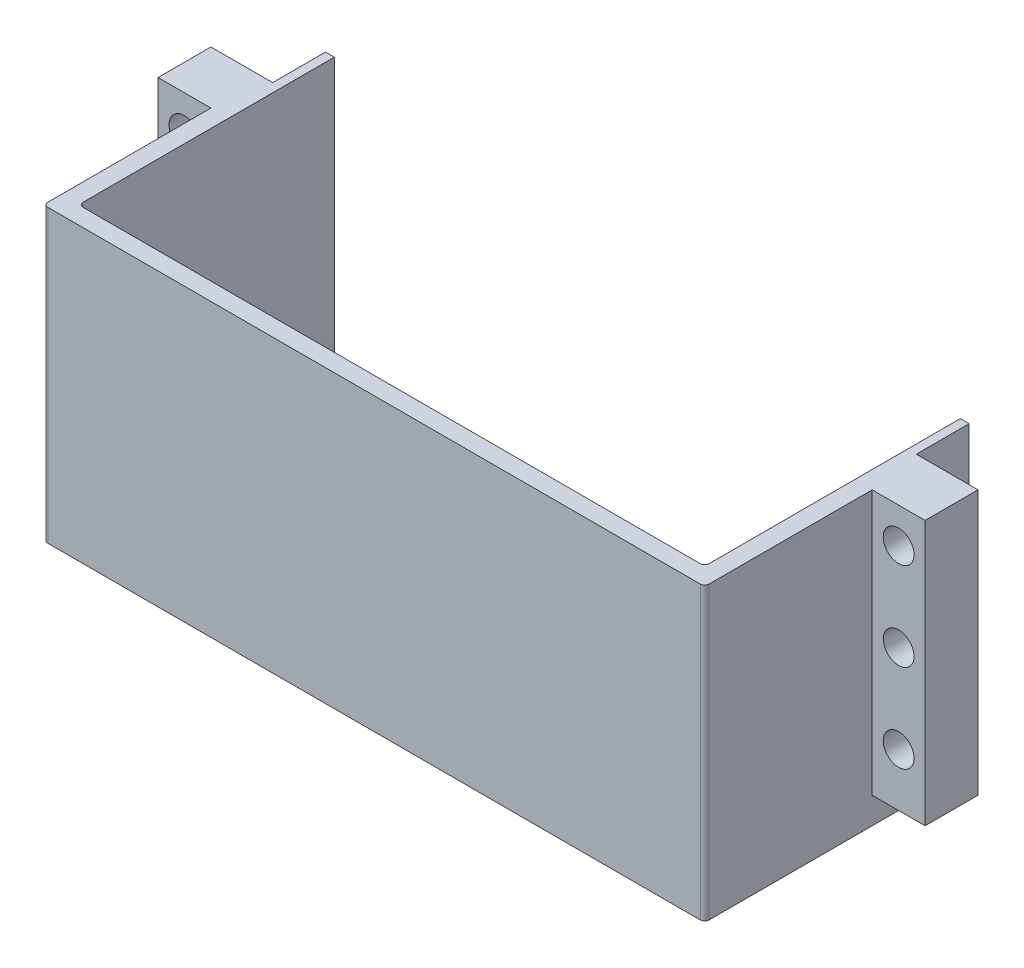
ISO-10303-21;
HEADER;
FILE_DESCRIPTION(('STEP AP214'),'2;1');
FILE_NAME('part.step','',(''),(''),'','','');
FILE_SCHEMA(('AUTOMOTIVE_DESIGN { 1 0 10303 214 1 1 1 1 }'));
ENDSEC;
DATA;
#1=APPLICATION_CONTEXT('core data for automotive mechanical design processes');
#2=APPLICATION_PROTOCOL_DEFINITION('international standard','automotive_design',2000,#1);
#3=PRODUCT_CONTEXT('',#1,'mechanical');
#4=PRODUCT('Part','Part','',(#3));
#5=PRODUCT_RELATED_PRODUCT_CATEGORY('part','',(#4));
#6=PRODUCT_DEFINITION_FORMATION('','',#4);
#7=PRODUCT_DEFINITION_CONTEXT('part definition',#1,'design');
#8=PRODUCT_DEFINITION('design','',#6,#7);
#9=PRODUCT_DEFINITION_SHAPE('','',#8);
#10=(LENGTH_UNIT() NAMED_UNIT(*) SI_UNIT(.MILLI.,.METRE.));
#11=(NAMED_UNIT(*) PLANE_ANGLE_UNIT() SI_UNIT($,.RADIAN.));
#12=(NAMED_UNIT(*) SI_UNIT($,.STERADIAN.) SOLID_ANGLE_UNIT());
#13=UNCERTAINTY_MEASURE_WITH_UNIT(LENGTH_MEASURE(1.E-05),#10,'distance_accuracy_value','');
#14=(GEOMETRIC_REPRESENTATION_CONTEXT(3) GLOBAL_UNCERTAINTY_ASSIGNED_CONTEXT((#13)) GLOBAL_UNIT_ASSIGNED_CONTEXT((#10,
#11,#12)) REPRESENTATION_CONTEXT('',''));
#15=CARTESIAN_POINT('',(0.,0.,0.));
#16=DIRECTION('',(0.,0.,1.));
#17=DIRECTION('',(1.,0.,0.));
#18=AXIS2_PLACEMENT_3D('',#15,#16,#17);
#19=CARTESIAN_POINT('',(-37.5,3.,-25.));
#20=DIRECTION('',(0.,0.,1.));
#21=DIRECTION('',(1.,0.,0.));
#22=AXIS2_PLACEMENT_3D('',#19,#20,#21);
#23=PLANE('',#22);
#24=CARTESIAN_POINT('',(40.5,29.,-25.));
#25=DIRECTION('',(0.,0.,-1.));
#26=DIRECTION('',(-1.,0.,0.));
#27=AXIS2_PLACEMENT_3D('',#24,#25,#26);
#28=CIRCLE('',#27,1.75);
#29=CARTESIAN_POINT('',(38.75,29.,-25.));
#30=VERTEX_POINT('',#29);
#31=EDGE_CURVE('E269',#30,#30,#28,.T.);
#32=ORIENTED_EDGE('',*,*,#31,.F.);
#33=EDGE_LOOP('',(#32));
#34=FACE_BOUND('',#33,.T.);
#35=CARTESIAN_POINT('',(-40.5,9.,-25.));
#36=DIRECTION('',(0.,0.,-1.));
#37=DIRECTION('',(-1.,0.,0.));
#38=AXIS2_PLACEMENT_3D('',#35,#36,#37);
#39=CIRCLE('',#38,1.75);
#40=CARTESIAN_POINT('',(-42.25,9.,-25.));
#41=VERTEX_POINT('',#40);
#42=EDGE_CURVE('E256',#41,#41,#39,.T.);
#43=ORIENTED_EDGE('',*,*,#42,.F.);
#44=EDGE_LOOP('',(#43));
#45=FACE_BOUND('',#44,.T.);
#46=CARTESIAN_POINT('',(-40.5,29.,-25.));
#47=DIRECTION('',(0.,0.,-1.));
#48=DIRECTION('',(-1.,0.,0.));
#49=AXIS2_PLACEMENT_3D('',#46,#47,#48);
#50=CIRCLE('',#49,1.75);
#51=CARTESIAN_POINT('',(-42.25,29.,-25.));
#52=VERTEX_POINT('',#51);
#53=EDGE_CURVE('E266',#52,#52,#50,.T.);
#54=ORIENTED_EDGE('',*,*,#53,.F.);
#55=EDGE_LOOP('',(#54));
#56=FACE_BOUND('',#55,.T.);
#57=CARTESIAN_POINT('',(40.5,19.,-25.));
#58=DIRECTION('',(0.,0.,-1.));
#59=DIRECTION('',(-1.,0.,0.));
#60=AXIS2_PLACEMENT_3D('',#57,#58,#59);
#61=CIRCLE('',#60,1.75);
#62=CARTESIAN_POINT('',(38.75,19.,-25.));
#63=VERTEX_POINT('',#62);
#64=EDGE_CURVE('E263',#63,#63,#61,.T.);
#65=ORIENTED_EDGE('',*,*,#64,.F.);
#66=EDGE_LOOP('',(#65));
#67=FACE_BOUND('',#66,.T.);
#68=CARTESIAN_POINT('',(40.5,9.,-25.));
#69=DIRECTION('',(0.,0.,-1.));
#70=DIRECTION('',(-1.,0.,0.));
#71=AXIS2_PLACEMENT_3D('',#68,#69,#70);
#72=CIRCLE('',#71,1.75);
#73=CARTESIAN_POINT('',(38.75,9.,-25.));
#74=VERTEX_POINT('',#73);
#75=EDGE_CURVE('E260',#74,#74,#72,.T.);
#76=ORIENTED_EDGE('',*,*,#75,.F.);
#77=EDGE_LOOP('',(#76));
#78=FACE_BOUND('',#77,.T.);
#79=CARTESIAN_POINT('',(-40.5,19.,-25.));
#80=DIRECTION('',(0.,0.,-1.));
#81=DIRECTION('',(-1.,0.,0.));
#82=AXIS2_PLACEMENT_3D('',#79,#80,#81);
#83=CIRCLE('',#82,1.75);
#84=CARTESIAN_POINT('',(-42.25,19.,-25.));
#85=VERTEX_POINT('',#84);
#86=EDGE_CURVE('E259',#85,#85,#83,.T.);
#87=ORIENTED_EDGE('',*,*,#86,.F.);
#88=EDGE_LOOP('',(#87));
#89=FACE_BOUND('',#88,.T.);
#90=DIRECTION('',(0.,1.,0.));
#91=VECTOR('',#90,1.);
#92=CARTESIAN_POINT('',(-36.5,33.,-25.));
#93=LINE('',#92,#91);
#94=CARTESIAN_POINT('',(-36.5,2.,-25.));
#95=VERTEX_POINT('',#94);
#96=CARTESIAN_POINT('',(-36.5,33.,-25.));
#97=VERTEX_POINT('',#96);
#98=EDGE_CURVE('E223',#95,#97,#93,.T.);
#99=ORIENTED_EDGE('',*,*,#98,.F.);
#100=DIRECTION('',(-1.,0.,0.));
#101=VECTOR('',#100,1.);
#102=CARTESIAN_POINT('',(36.5,1.99999999999983,-25.));
#103=LINE('',#102,#101);
#104=CARTESIAN_POINT('',(36.5,1.99999999999983,-25.));
#105=VERTEX_POINT('',#104);
#106=EDGE_CURVE('E226',#105,#95,#103,.T.);
#107=ORIENTED_EDGE('',*,*,#106,.F.);
#108=DIRECTION('',(0.,-1.,0.));
#109=VECTOR('',#108,1.);
#110=CARTESIAN_POINT('',(36.5000000000001,32.9999999999998,-25.));
#111=LINE('',#110,#109);
#112=CARTESIAN_POINT('',(36.5000000000001,33.,-25.));
#113=VERTEX_POINT('',#112);
#114=EDGE_CURVE('E240',#113,#105,#111,.T.);
#115=ORIENTED_EDGE('',*,*,#114,.F.);
#116=DIRECTION('',(-1.,0.,0.));
#117=VECTOR('',#116,1.);
#118=CARTESIAN_POINT('',(37.5,33.,-25.));
#119=LINE('',#118,#117);
#120=CARTESIAN_POINT('',(43.5,33.,-25.));
#121=VERTEX_POINT('',#120);
#122=EDGE_CURVE('E332',#121,#113,#119,.T.);
#123=ORIENTED_EDGE('',*,*,#122,.F.);
#124=DIRECTION('',(0.,1.,0.));
#125=VECTOR('',#124,1.);
#126=CARTESIAN_POINT('',(43.5,33.,-25.));
#127=LINE('',#126,#125);
#128=CARTESIAN_POINT('',(43.5,3.,-25.));
#129=VERTEX_POINT('',#128);
#130=EDGE_CURVE('E302',#129,#121,#127,.T.);
#131=ORIENTED_EDGE('',*,*,#130,.F.);
#132=DIRECTION('',(-1.,0.,0.));
#133=VECTOR('',#132,1.);
#134=CARTESIAN_POINT('',(43.5,3.,-25.));
#135=LINE('',#134,#133);
#136=CARTESIAN_POINT('',(37.5,3.,-25.));
#137=VERTEX_POINT('',#136);
#138=EDGE_CURVE('E312',#129,#137,#135,.T.);
#139=ORIENTED_EDGE('',*,*,#138,.T.);
#140=DIRECTION('',(0.,-1.,0.));
#141=VECTOR('',#140,1.);
#142=CARTESIAN_POINT('',(37.5,3.,-25.));
#143=LINE('',#142,#141);
#144=CARTESIAN_POINT('',(37.5,0.,-25.));
#145=VERTEX_POINT('',#144);
#146=EDGE_CURVE('E357',#137,#145,#143,.T.);
#147=ORIENTED_EDGE('',*,*,#146,.T.);
#148=DIRECTION('',(-1.,0.,0.));
#149=VECTOR('',#148,1.);
#150=CARTESIAN_POINT('',(-37.5,0.,-25.));
#151=LINE('',#150,#149);
#152=CARTESIAN_POINT('',(-37.5,0.,-25.));
#153=VERTEX_POINT('',#152);
#154=EDGE_CURVE('E348',#145,#153,#151,.T.);
#155=ORIENTED_EDGE('',*,*,#154,.T.);
#156=DIRECTION('',(0.,-1.,0.));
#157=VECTOR('',#156,1.);
#158=CARTESIAN_POINT('',(-37.5,3.,-25.));
#159=LINE('',#158,#157);
#160=CARTESIAN_POINT('',(-37.5,3.,-25.));
#161=VERTEX_POINT('',#160);
#162=EDGE_CURVE('E355',#161,#153,#159,.T.);
#163=ORIENTED_EDGE('',*,*,#162,.F.);
#164=DIRECTION('',(1.,0.,0.));
#165=VECTOR('',#164,1.);
#166=CARTESIAN_POINT('',(-43.5,3.,-25.));
#167=LINE('',#166,#165);
#168=CARTESIAN_POINT('',(-43.5,3.,-25.));
#169=VERTEX_POINT('',#168);
#170=EDGE_CURVE('E298',#169,#161,#167,.T.);
#171=ORIENTED_EDGE('',*,*,#170,.F.);
#172=DIRECTION('',(0.,-1.,0.));
#173=VECTOR('',#172,1.);
#174=CARTESIAN_POINT('',(-43.5,33.,-25.));
#175=LINE('',#174,#173);
#176=CARTESIAN_POINT('',(-43.5,33.,-25.));
#177=VERTEX_POINT('',#176);
#178=EDGE_CURVE('E275',#177,#169,#175,.T.);
#179=ORIENTED_EDGE('',*,*,#178,.F.);
#180=DIRECTION('',(-1.,0.,0.));
#181=VECTOR('',#180,1.);
#182=CARTESIAN_POINT('',(-35.5,33.,-25.));
#183=LINE('',#182,#181);
#184=EDGE_CURVE('E205',#97,#177,#183,.T.);
#185=ORIENTED_EDGE('',*,*,#184,.F.);
#186=EDGE_LOOP('',(#99,#107,#115,#123,#131,#139,#147,#155,#163,#171,#179,#185));
#187=FACE_BOUND('',#186,.T.);
#188=ADVANCED_FACE('F45',(#34,#45,#56,#67,#78,#89,#187),#23,.F.);
#189=CARTESIAN_POINT('',(-37.5,3.,0.));
#190=DIRECTION('',(1.,0.,0.));
#191=DIRECTION('',(0.,0.,-1.));
#192=AXIS2_PLACEMENT_3D('',#189,#190,#191);
#193=PLANE('',#192);
#194=DIRECTION('',(0.,0.,1.));
#195=VECTOR('',#194,1.);
#196=CARTESIAN_POINT('',(-37.5,0.,0.));
#197=LINE('',#196,#195);
#198=CARTESIAN_POINT('',(-37.5,0.,-0.5));
#199=VERTEX_POINT('',#198);
#200=EDGE_CURVE('E351',#153,#199,#197,.T.);
#201=ORIENTED_EDGE('',*,*,#200,.T.);
#202=DIRECTION('',(0.,-1.,0.));
#203=VECTOR('',#202,1.);
#204=CARTESIAN_POINT('',(-37.5,3.,-0.5));
#205=LINE('',#204,#203);
#206=CARTESIAN_POINT('',(-37.5,33.,-0.5));
#207=VERTEX_POINT('',#206);
#208=EDGE_CURVE('E11',#199,#207,#205,.F.);
#209=ORIENTED_EDGE('',*,*,#208,.T.);
#210=DIRECTION('',(0.,0.,1.));
#211=VECTOR('',#210,1.);
#212=CARTESIAN_POINT('',(-37.5,33.,-25.));
#213=LINE('',#212,#211);
#214=CARTESIAN_POINT('',(-37.5,33.,-19.));
#215=VERTEX_POINT('',#214);
#216=EDGE_CURVE('E326',#215,#207,#213,.T.);
#217=ORIENTED_EDGE('',*,*,#216,.F.);
#218=DIRECTION('',(0.,1.,0.));
#219=VECTOR('',#218,1.);
#220=CARTESIAN_POINT('',(-37.5,33.,-19.));
#221=LINE('',#220,#219);
#222=CARTESIAN_POINT('',(-37.5,3.,-19.));
#223=VERTEX_POINT('',#222);
#224=EDGE_CURVE('E279',#223,#215,#221,.T.);
#225=ORIENTED_EDGE('',*,*,#224,.F.);
#226=DIRECTION('',(0.,0.,1.));
#227=VECTOR('',#226,1.);
#228=CARTESIAN_POINT('',(-37.5,3.,-25.));
#229=LINE('',#228,#227);
#230=EDGE_CURVE('E287',#161,#223,#229,.T.);
#231=ORIENTED_EDGE('',*,*,#230,.F.);
#232=ORIENTED_EDGE('',*,*,#162,.T.);
#233=EDGE_LOOP('',(#201,#209,#217,#225,#231,#232));
#234=FACE_BOUND('',#233,.T.);
#235=ADVANCED_FACE('F425',(#234),#193,.F.);
#236=CARTESIAN_POINT('',(37.5,3.,0.));
#237=DIRECTION('',(-1.,0.,0.));
#238=DIRECTION('',(0.,0.,1.));
#239=AXIS2_PLACEMENT_3D('',#236,#237,#238);
#240=PLANE('',#239);
#241=DIRECTION('',(0.,0.,-1.));
#242=VECTOR('',#241,1.);
#243=CARTESIAN_POINT('',(37.5,33.,0.));
#244=LINE('',#243,#242);
#245=CARTESIAN_POINT('',(37.5,33.,-0.5));
#246=VERTEX_POINT('',#245);
#247=CARTESIAN_POINT('',(37.5,33.,-19.));
#248=VERTEX_POINT('',#247);
#249=EDGE_CURVE('E330',#246,#248,#244,.T.);
#250=ORIENTED_EDGE('',*,*,#249,.F.);
#251=DIRECTION('',(0.,-1.,0.));
#252=VECTOR('',#251,1.);
#253=CARTESIAN_POINT('',(37.5,3.,-0.5));
#254=LINE('',#253,#252);
#255=CARTESIAN_POINT('',(37.5,0.,-0.5));
#256=VERTEX_POINT('',#255);
#257=EDGE_CURVE('E392',#246,#256,#254,.T.);
#258=ORIENTED_EDGE('',*,*,#257,.T.);
#259=DIRECTION('',(0.,0.,-1.));
#260=VECTOR('',#259,1.);
#261=CARTESIAN_POINT('',(37.5,0.,0.));
#262=LINE('',#261,#260);
#263=EDGE_CURVE('E343',#256,#145,#262,.T.);
#264=ORIENTED_EDGE('',*,*,#263,.T.);
#265=ORIENTED_EDGE('',*,*,#146,.F.);
#266=DIRECTION('',(0.,0.,-1.));
#267=VECTOR('',#266,1.);
#268=CARTESIAN_POINT('',(37.5,3.,-25.));
#269=LINE('',#268,#267);
#270=CARTESIAN_POINT('',(37.5,3.,-19.));
#271=VERTEX_POINT('',#270);
#272=EDGE_CURVE('E306',#271,#137,#269,.T.);
#273=ORIENTED_EDGE('',*,*,#272,.F.);
#274=DIRECTION('',(0.,-1.,0.));
#275=VECTOR('',#274,1.);
#276=CARTESIAN_POINT('',(37.5,33.,-19.));
#277=LINE('',#276,#275);
#278=EDGE_CURVE('E301',#248,#271,#277,.T.);
#279=ORIENTED_EDGE('',*,*,#278,.F.);
#280=EDGE_LOOP('',(#250,#258,#264,#265,#273,#279));
#281=FACE_BOUND('',#280,.T.);
#282=ADVANCED_FACE('F413',(#281),#240,.F.);
#283=CARTESIAN_POINT('',(0.,3.,0.));
#284=DIRECTION('',(0.,-1.,0.));
#285=DIRECTION('',(0.,0.,-1.));
#286=AXIS2_PLACEMENT_3D('',#283,#284,#285);
#287=PLANE('',#286);
#288=DIRECTION('',(-1.,0.,0.));
#289=VECTOR('',#288,1.);
#290=CARTESIAN_POINT('',(-35.5,3.,-2.));
#291=LINE('',#290,#289);
#292=CARTESIAN_POINT('',(35.,3.,-2.));
#293=VERTEX_POINT('',#292);
#294=CARTESIAN_POINT('',(-35.,3.,-2.));
#295=VERTEX_POINT('',#294);
#296=EDGE_CURVE('E206',#293,#295,#291,.T.);
#297=ORIENTED_EDGE('',*,*,#296,.F.);
#298=CARTESIAN_POINT('',(35.,3.,-2.5));
#299=DIRECTION('',(0.,-1.,0.));
#300=DIRECTION('',(0.,0.,-1.));
#301=AXIS2_PLACEMENT_3D('',#298,#299,#300);
#302=CIRCLE('',#301,0.5);
#303=CARTESIAN_POINT('',(35.5,3.,-2.5));
#304=VERTEX_POINT('',#303);
#305=EDGE_CURVE('E383',#293,#304,#302,.F.);
#306=ORIENTED_EDGE('',*,*,#305,.T.);
#307=DIRECTION('',(0.,0.,1.));
#308=VECTOR('',#307,1.);
#309=CARTESIAN_POINT('',(35.5,3.,-2.));
#310=LINE('',#309,#308);
#311=CARTESIAN_POINT('',(35.5,3.,-31.));
#312=VERTEX_POINT('',#311);
#313=EDGE_CURVE('E213',#312,#304,#310,.T.);
#314=ORIENTED_EDGE('',*,*,#313,.F.);
#315=DIRECTION('',(1.,0.,0.));
#316=VECTOR('',#315,1.);
#317=CARTESIAN_POINT('',(35.5,3.,-31.));
#318=LINE('',#317,#316);
#319=CARTESIAN_POINT('',(-35.5,3.,-31.));
#320=VERTEX_POINT('',#319);
#321=EDGE_CURVE('E209',#320,#312,#318,.T.);
#322=ORIENTED_EDGE('',*,*,#321,.F.);
#323=DIRECTION('',(0.,0.,-1.));
#324=VECTOR('',#323,1.);
#325=CARTESIAN_POINT('',(-35.5,3.,-25.));
#326=LINE('',#325,#324);
#327=CARTESIAN_POINT('',(-35.5,3.,-2.5));
#328=VERTEX_POINT('',#327);
#329=EDGE_CURVE('E196',#328,#320,#326,.T.);
#330=ORIENTED_EDGE('',*,*,#329,.F.);
#331=CARTESIAN_POINT('',(-35.,3.,-2.5));
#332=DIRECTION('',(0.,-1.,0.));
#333=DIRECTION('',(0.,0.,-1.));
#334=AXIS2_PLACEMENT_3D('',#331,#332,#333);
#335=CIRCLE('',#334,0.5);
#336=EDGE_CURVE('E381',#328,#295,#335,.F.);
#337=ORIENTED_EDGE('',*,*,#336,.T.);
#338=EDGE_LOOP('',(#297,#306,#314,#322,#330,#337));
#339=FACE_BOUND('',#338,.T.);
#340=ADVANCED_FACE('F211',(#339),#287,.F.);
#341=CARTESIAN_POINT('',(-37.5,3.,0.));
#342=DIRECTION('',(0.,0.,-1.));
#343=DIRECTION('',(-1.,0.,0.));
#344=AXIS2_PLACEMENT_3D('',#341,#342,#343);
#345=PLANE('',#344);
#346=DIRECTION('',(1.,0.,0.));
#347=VECTOR('',#346,1.);
#348=CARTESIAN_POINT('',(-37.5,0.,0.));
#349=LINE('',#348,#347);
#350=CARTESIAN_POINT('',(-37.,0.,0.));
#351=VERTEX_POINT('',#350);
#352=CARTESIAN_POINT('',(37.,0.,0.));
#353=VERTEX_POINT('',#352);
#354=EDGE_CURVE('E353',#351,#353,#349,.T.);
#355=ORIENTED_EDGE('',*,*,#354,.T.);
#356=DIRECTION('',(0.,-1.,0.));
#357=VECTOR('',#356,1.);
#358=CARTESIAN_POINT('',(37.,3.,0.));
#359=LINE('',#358,#357);
#360=CARTESIAN_POINT('',(37.,33.,0.));
#361=VERTEX_POINT('',#360);
#362=EDGE_CURVE('E66',#353,#361,#359,.F.);
#363=ORIENTED_EDGE('',*,*,#362,.T.);
#364=DIRECTION('',(1.,0.,0.));
#365=VECTOR('',#364,1.);
#366=CARTESIAN_POINT('',(-37.5,33.,0.));
#367=LINE('',#366,#365);
#368=CARTESIAN_POINT('',(-37.,33.,0.));
#369=VERTEX_POINT('',#368);
#370=EDGE_CURVE('E328',#369,#361,#367,.T.);
#371=ORIENTED_EDGE('',*,*,#370,.F.);
#372=DIRECTION('',(0.,-1.,0.));
#373=VECTOR('',#372,1.);
#374=CARTESIAN_POINT('',(-37.,3.,0.));
#375=LINE('',#374,#373);
#376=EDGE_CURVE('E399',#369,#351,#375,.T.);
#377=ORIENTED_EDGE('',*,*,#376,.T.);
#378=EDGE_LOOP('',(#355,#363,#371,#377));
#379=FACE_BOUND('',#378,.T.);
#380=ADVANCED_FACE('F420',(#379),#345,.F.);
#381=CARTESIAN_POINT('',(0.,0.,0.));
#382=DIRECTION('',(0.,-1.,0.));
#383=DIRECTION('',(0.,0.,-1.));
#384=AXIS2_PLACEMENT_3D('',#381,#382,#383);
#385=PLANE('',#384);
#386=ORIENTED_EDGE('',*,*,#263,.F.);
#387=CARTESIAN_POINT('',(37.,0.,-0.5));
#388=DIRECTION('',(0.,-1.,0.));
#389=DIRECTION('',(0.,0.,-1.));
#390=AXIS2_PLACEMENT_3D('',#387,#388,#389);
#391=CIRCLE('',#390,0.5);
#392=EDGE_CURVE('E397',#256,#353,#391,.T.);
#393=ORIENTED_EDGE('',*,*,#392,.T.);
#394=ORIENTED_EDGE('',*,*,#354,.F.);
#395=CARTESIAN_POINT('',(-37.,0.,-0.5));
#396=DIRECTION('',(0.,-1.,0.));
#397=DIRECTION('',(0.,0.,-1.));
#398=AXIS2_PLACEMENT_3D('',#395,#396,#397);
#399=CIRCLE('',#398,0.5);
#400=EDGE_CURVE('E395',#351,#199,#399,.T.);
#401=ORIENTED_EDGE('',*,*,#400,.T.);
#402=ORIENTED_EDGE('',*,*,#200,.F.);
#403=ORIENTED_EDGE('',*,*,#154,.F.);
#404=EDGE_LOOP('',(#386,#393,#394,#401,#402,#403));
#405=FACE_BOUND('',#404,.T.);
#406=ADVANCED_FACE('F418',(#405),#385,.T.);
#407=CARTESIAN_POINT('',(35.5,33.,-2.));
#408=DIRECTION('',(1.,0.,0.));
#409=DIRECTION('',(0.,0.,-1.));
#410=AXIS2_PLACEMENT_3D('',#407,#408,#409);
#411=PLANE('',#410);
#412=ORIENTED_EDGE('',*,*,#313,.T.);
#413=DIRECTION('',(0.,-1.,0.));
#414=VECTOR('',#413,1.);
#415=CARTESIAN_POINT('',(35.5,33.,-2.5));
#416=LINE('',#415,#414);
#417=CARTESIAN_POINT('',(35.5,33.,-2.5));
#418=VERTEX_POINT('',#417);
#419=EDGE_CURVE('E385',#304,#418,#416,.F.);
#420=ORIENTED_EDGE('',*,*,#419,.T.);
#421=DIRECTION('',(0.,0.,1.));
#422=VECTOR('',#421,1.);
#423=CARTESIAN_POINT('',(35.5,33.,-2.));
#424=LINE('',#423,#422);
#425=CARTESIAN_POINT('',(35.5000000000001,32.9999999999998,-31.));
#426=VERTEX_POINT('',#425);
#427=EDGE_CURVE('E335',#426,#418,#424,.T.);
#428=ORIENTED_EDGE('',*,*,#427,.F.);
#429=DIRECTION('',(0.,1.,0.));
#430=VECTOR('',#429,1.);
#431=CARTESIAN_POINT('',(35.5000000000001,32.9999999999998,-31.));
#432=LINE('',#431,#430);
#433=EDGE_CURVE('E217',#312,#426,#432,.T.);
#434=ORIENTED_EDGE('',*,*,#433,.F.);
#435=EDGE_LOOP('',(#412,#420,#428,#434));
#436=FACE_BOUND('',#435,.T.);
#437=ADVANCED_FACE('F582',(#436),#411,.F.);
#438=CARTESIAN_POINT('',(-35.5,33.,-2.));
#439=DIRECTION('',(0.,0.,1.));
#440=DIRECTION('',(1.,0.,0.));
#441=AXIS2_PLACEMENT_3D('',#438,#439,#440);
#442=PLANE('',#441);
#443=DIRECTION('',(-1.,0.,0.));
#444=VECTOR('',#443,1.);
#445=CARTESIAN_POINT('',(-35.5,33.,-2.));
#446=LINE('',#445,#444);
#447=CARTESIAN_POINT('',(35.,33.,-2.));
#448=VERTEX_POINT('',#447);
#449=CARTESIAN_POINT('',(-35.,33.,-2.));
#450=VERTEX_POINT('',#449);
#451=EDGE_CURVE('E338',#448,#450,#446,.T.);
#452=ORIENTED_EDGE('',*,*,#451,.F.);
#453=DIRECTION('',(0.,-1.,0.));
#454=VECTOR('',#453,1.);
#455=CARTESIAN_POINT('',(35.,3.,-2.));
#456=LINE('',#455,#454);
#457=EDGE_CURVE('E378',#448,#293,#456,.T.);
#458=ORIENTED_EDGE('',*,*,#457,.T.);
#459=ORIENTED_EDGE('',*,*,#296,.T.);
#460=DIRECTION('',(0.,-1.,0.));
#461=VECTOR('',#460,1.);
#462=CARTESIAN_POINT('',(-35.,33.,-2.));
#463=LINE('',#462,#461);
#464=EDGE_CURVE('E360',#295,#450,#463,.F.);
#465=ORIENTED_EDGE('',*,*,#464,.T.);
#466=EDGE_LOOP('',(#452,#458,#459,#465));
#467=FACE_BOUND('',#466,.T.);
#468=ADVANCED_FACE('F461',(#467),#442,.F.);
#469=CARTESIAN_POINT('',(-35.5,33.,-25.));
#470=DIRECTION('',(-1.,0.,0.));
#471=DIRECTION('',(0.,0.,1.));
#472=AXIS2_PLACEMENT_3D('',#469,#470,#471);
#473=PLANE('',#472);
#474=DIRECTION('',(0.,0.,-1.));
#475=VECTOR('',#474,1.);
#476=CARTESIAN_POINT('',(-35.5,33.,-25.));
#477=LINE('',#476,#475);
#478=CARTESIAN_POINT('',(-35.5,33.,-2.5));
#479=VERTEX_POINT('',#478);
#480=CARTESIAN_POINT('',(-35.5,33.,-31.));
#481=VERTEX_POINT('',#480);
#482=EDGE_CURVE('E341',#479,#481,#477,.T.);
#483=ORIENTED_EDGE('',*,*,#482,.F.);
#484=DIRECTION('',(0.,-1.,0.));
#485=VECTOR('',#484,1.);
#486=CARTESIAN_POINT('',(-35.5,3.,-2.5));
#487=LINE('',#486,#485);
#488=EDGE_CURVE('E203',#479,#328,#487,.T.);
#489=ORIENTED_EDGE('',*,*,#488,.T.);
#490=ORIENTED_EDGE('',*,*,#329,.T.);
#491=DIRECTION('',(0.,-1.,0.));
#492=VECTOR('',#491,1.);
#493=CARTESIAN_POINT('',(-35.5,33.,-31.));
#494=LINE('',#493,#492);
#495=EDGE_CURVE('E201',#481,#320,#494,.T.);
#496=ORIENTED_EDGE('',*,*,#495,.F.);
#497=EDGE_LOOP('',(#483,#489,#490,#496));
#498=FACE_BOUND('',#497,.T.);
#499=ADVANCED_FACE('F199',(#498),#473,.F.);
#500=CARTESIAN_POINT('',(0.,33.,0.));
#501=DIRECTION('',(0.,1.,0.));
#502=DIRECTION('',(0.,0.,1.));
#503=AXIS2_PLACEMENT_3D('',#500,#501,#502);
#504=PLANE('',#503);
#505=ORIENTED_EDGE('',*,*,#370,.T.);
#506=CARTESIAN_POINT('',(37.,33.,-0.5));
#507=DIRECTION('',(0.,1.,0.));
#508=DIRECTION('',(0.,0.,1.));
#509=AXIS2_PLACEMENT_3D('',#506,#507,#508);
#510=CIRCLE('',#509,0.5);
#511=EDGE_CURVE('E53',#361,#246,#510,.T.);
#512=ORIENTED_EDGE('',*,*,#511,.T.);
#513=ORIENTED_EDGE('',*,*,#249,.T.);
#514=DIRECTION('',(-1.,0.,0.));
#515=VECTOR('',#514,1.);
#516=CARTESIAN_POINT('',(43.5,33.,-19.));
#517=LINE('',#516,#515);
#518=CARTESIAN_POINT('',(43.5,33.,-19.));
#519=VERTEX_POINT('',#518);
#520=EDGE_CURVE('E322',#519,#248,#517,.T.);
#521=ORIENTED_EDGE('',*,*,#520,.F.);
#522=DIRECTION('',(0.,0.,1.));
#523=VECTOR('',#522,1.);
#524=CARTESIAN_POINT('',(43.5,33.,-25.));
#525=LINE('',#524,#523);
#526=EDGE_CURVE('E305',#121,#519,#525,.T.);
#527=ORIENTED_EDGE('',*,*,#526,.F.);
#528=ORIENTED_EDGE('',*,*,#122,.T.);
#529=DIRECTION('',(0.,0.,1.));
#530=VECTOR('',#529,1.);
#531=CARTESIAN_POINT('',(36.5000000000001,32.9999999999998,-31.));
#532=LINE('',#531,#530);
#533=CARTESIAN_POINT('',(36.5000000000001,32.9999999999998,-31.));
#534=VERTEX_POINT('',#533);
#535=EDGE_CURVE('E253',#534,#113,#532,.T.);
#536=ORIENTED_EDGE('',*,*,#535,.F.);
#537=DIRECTION('',(1.,0.,0.));
#538=VECTOR('',#537,1.);
#539=CARTESIAN_POINT('',(35.5000000000001,32.9999999999998,-31.));
#540=LINE('',#539,#538);
#541=EDGE_CURVE('E230',#426,#534,#540,.T.);
#542=ORIENTED_EDGE('',*,*,#541,.F.);
#543=ORIENTED_EDGE('',*,*,#427,.T.);
#544=CARTESIAN_POINT('',(35.,33.,-2.5));
#545=DIRECTION('',(0.,1.,0.));
#546=DIRECTION('',(0.,0.,1.));
#547=AXIS2_PLACEMENT_3D('',#544,#545,#546);
#548=CIRCLE('',#547,0.5);
#549=EDGE_CURVE('E388',#418,#448,#548,.F.);
#550=ORIENTED_EDGE('',*,*,#549,.T.);
#551=ORIENTED_EDGE('',*,*,#451,.T.);
#552=CARTESIAN_POINT('',(-35.,33.,-2.5));
#553=DIRECTION('',(0.,1.,0.));
#554=DIRECTION('',(0.,0.,1.));
#555=AXIS2_PLACEMENT_3D('',#552,#553,#554);
#556=CIRCLE('',#555,0.5);
#557=EDGE_CURVE('E390',#450,#479,#556,.F.);
#558=ORIENTED_EDGE('',*,*,#557,.T.);
#559=ORIENTED_EDGE('',*,*,#482,.T.);
#560=DIRECTION('',(1.,0.,0.));
#561=VECTOR('',#560,1.);
#562=CARTESIAN_POINT('',(-35.5,33.,-31.));
#563=LINE('',#562,#561);
#564=CARTESIAN_POINT('',(-36.5,33.,-31.));
#565=VERTEX_POINT('',#564);
#566=EDGE_CURVE('E222',#565,#481,#563,.T.);
#567=ORIENTED_EDGE('',*,*,#566,.F.);
#568=DIRECTION('',(0.,0.,1.));
#569=VECTOR('',#568,1.);
#570=CARTESIAN_POINT('',(-36.5,33.,-31.));
#571=LINE('',#570,#569);
#572=EDGE_CURVE('E239',#565,#97,#571,.T.);
#573=ORIENTED_EDGE('',*,*,#572,.T.);
#574=ORIENTED_EDGE('',*,*,#184,.T.);
#575=DIRECTION('',(0.,0.,-1.));
#576=VECTOR('',#575,1.);
#577=CARTESIAN_POINT('',(-43.5,33.,-25.));
#578=LINE('',#577,#576);
#579=CARTESIAN_POINT('',(-43.5,33.,-19.));
#580=VERTEX_POINT('',#579);
#581=EDGE_CURVE('E283',#580,#177,#578,.T.);
#582=ORIENTED_EDGE('',*,*,#581,.F.);
#583=DIRECTION('',(1.,0.,0.));
#584=VECTOR('',#583,1.);
#585=CARTESIAN_POINT('',(-43.5,33.,-19.));
#586=LINE('',#585,#584);
#587=EDGE_CURVE('E286',#580,#215,#586,.T.);
#588=ORIENTED_EDGE('',*,*,#587,.T.);
#589=ORIENTED_EDGE('',*,*,#216,.T.);
#590=CARTESIAN_POINT('',(-37.,33.,-0.5));
#591=DIRECTION('',(0.,1.,0.));
#592=DIRECTION('',(0.,0.,1.));
#593=AXIS2_PLACEMENT_3D('',#590,#591,#592);
#594=CIRCLE('',#593,0.5);
#595=EDGE_CURVE('E403',#207,#369,#594,.T.);
#596=ORIENTED_EDGE('',*,*,#595,.T.);
#597=EDGE_LOOP('',(#505,#512,#513,#521,#527,#528,#536,#542,#543,#550,#551,#558,#559,#567,#573,
#574,#582,#588,#589,#596));
#598=FACE_BOUND('',#597,.T.);
#599=ADVANCED_FACE('F407',(#598),#504,.T.);
#600=CARTESIAN_POINT('',(43.5,33.,-19.));
#601=DIRECTION('',(0.,0.,-1.));
#602=DIRECTION('',(-1.,0.,0.));
#603=AXIS2_PLACEMENT_3D('',#600,#601,#602);
#604=PLANE('',#603);
#605=CARTESIAN_POINT('',(40.5,9.,-19.));
#606=DIRECTION('',(0.,0.,-1.));
#607=DIRECTION('',(-1.,0.,0.));
#608=AXIS2_PLACEMENT_3D('',#605,#606,#607);
#609=CIRCLE('',#608,1.75);
#610=CARTESIAN_POINT('',(38.75,9.,-19.));
#611=VERTEX_POINT('',#610);
#612=EDGE_CURVE('E290',#611,#611,#609,.T.);
#613=ORIENTED_EDGE('',*,*,#612,.T.);
#614=EDGE_LOOP('',(#613));
#615=FACE_BOUND('',#614,.T.);
#616=CARTESIAN_POINT('',(40.5,19.,-19.));
#617=DIRECTION('',(0.,0.,-1.));
#618=DIRECTION('',(-1.,0.,0.));
#619=AXIS2_PLACEMENT_3D('',#616,#617,#618);
#620=CIRCLE('',#619,1.75);
#621=CARTESIAN_POINT('',(38.75,19.,-19.));
#622=VERTEX_POINT('',#621);
#623=EDGE_CURVE('E372',#622,#622,#620,.T.);
#624=ORIENTED_EDGE('',*,*,#623,.T.);
#625=EDGE_LOOP('',(#624));
#626=FACE_BOUND('',#625,.T.);
#627=CARTESIAN_POINT('',(40.5,29.,-19.));
#628=DIRECTION('',(0.,0.,-1.));
#629=DIRECTION('',(-1.,0.,0.));
#630=AXIS2_PLACEMENT_3D('',#627,#628,#629);
#631=CIRCLE('',#630,1.75);
#632=CARTESIAN_POINT('',(38.75,29.,-19.));
#633=VERTEX_POINT('',#632);
#634=EDGE_CURVE('E369',#633,#633,#631,.T.);
#635=ORIENTED_EDGE('',*,*,#634,.T.);
#636=EDGE_LOOP('',(#635));
#637=FACE_BOUND('',#636,.T.);
#638=ORIENTED_EDGE('',*,*,#278,.T.);
#639=DIRECTION('',(-1.,0.,0.));
#640=VECTOR('',#639,1.);
#641=CARTESIAN_POINT('',(43.5,3.,-19.));
#642=LINE('',#641,#640);
#643=CARTESIAN_POINT('',(43.5,3.,-19.));
#644=VERTEX_POINT('',#643);
#645=EDGE_CURVE('E319',#644,#271,#642,.T.);
#646=ORIENTED_EDGE('',*,*,#645,.F.);
#647=DIRECTION('',(0.,-1.,0.));
#648=VECTOR('',#647,1.);
#649=CARTESIAN_POINT('',(43.5,33.,-19.));
#650=LINE('',#649,#648);
#651=EDGE_CURVE('E308',#519,#644,#650,.T.);
#652=ORIENTED_EDGE('',*,*,#651,.F.);
#653=ORIENTED_EDGE('',*,*,#520,.T.);
#654=EDGE_LOOP('',(#638,#646,#652,#653));
#655=FACE_BOUND('',#654,.T.);
#656=ADVANCED_FACE('F437',(#615,#626,#637,#655),#604,.F.);
#657=CARTESIAN_POINT('',(43.5,3.,-25.));
#658=DIRECTION('',(0.,1.,0.));
#659=DIRECTION('',(0.,0.,1.));
#660=AXIS2_PLACEMENT_3D('',#657,#658,#659);
#661=PLANE('',#660);
#662=ORIENTED_EDGE('',*,*,#272,.T.);
#663=ORIENTED_EDGE('',*,*,#138,.F.);
#664=DIRECTION('',(0.,0.,-1.));
#665=VECTOR('',#664,1.);
#666=CARTESIAN_POINT('',(43.5,3.,-25.));
#667=LINE('',#666,#665);
#668=EDGE_CURVE('E310',#644,#129,#667,.T.);
#669=ORIENTED_EDGE('',*,*,#668,.F.);
#670=ORIENTED_EDGE('',*,*,#645,.T.);
#671=EDGE_LOOP('',(#662,#663,#669,#670));
#672=FACE_BOUND('',#671,.T.);
#673=ADVANCED_FACE('F432',(#672),#661,.F.);
#674=CARTESIAN_POINT('',(43.5,0.,0.));
#675=DIRECTION('',(-1.,0.,0.));
#676=DIRECTION('',(0.,0.,1.));
#677=AXIS2_PLACEMENT_3D('',#674,#675,#676);
#678=PLANE('',#677);
#679=ORIENTED_EDGE('',*,*,#130,.T.);
#680=ORIENTED_EDGE('',*,*,#526,.T.);
#681=ORIENTED_EDGE('',*,*,#651,.T.);
#682=ORIENTED_EDGE('',*,*,#668,.T.);
#683=EDGE_LOOP('',(#679,#680,#681,#682));
#684=FACE_BOUND('',#683,.T.);
#685=ADVANCED_FACE('F441',(#684),#678,.F.);
#686=CARTESIAN_POINT('',(-43.5,3.,-25.));
#687=DIRECTION('',(0.,1.,0.));
#688=DIRECTION('',(0.,0.,1.));
#689=AXIS2_PLACEMENT_3D('',#686,#687,#688);
#690=PLANE('',#689);
#691=ORIENTED_EDGE('',*,*,#230,.T.);
#692=DIRECTION('',(1.,0.,0.));
#693=VECTOR('',#692,1.);
#694=CARTESIAN_POINT('',(-43.5,3.,-19.));
#695=LINE('',#694,#693);
#696=CARTESIAN_POINT('',(-43.5,3.,-19.));
#697=VERTEX_POINT('',#696);
#698=EDGE_CURVE('E295',#697,#223,#695,.T.);
#699=ORIENTED_EDGE('',*,*,#698,.F.);
#700=DIRECTION('',(0.,0.,1.));
#701=VECTOR('',#700,1.);
#702=CARTESIAN_POINT('',(-43.5,3.,-25.));
#703=LINE('',#702,#701);
#704=EDGE_CURVE('E278',#169,#697,#703,.T.);
#705=ORIENTED_EDGE('',*,*,#704,.F.);
#706=ORIENTED_EDGE('',*,*,#170,.T.);
#707=EDGE_LOOP('',(#691,#699,#705,#706));
#708=FACE_BOUND('',#707,.T.);
#709=ADVANCED_FACE('F478',(#708),#690,.F.);
#710=CARTESIAN_POINT('',(-43.5,33.,-19.));
#711=DIRECTION('',(0.,0.,-1.));
#712=DIRECTION('',(-1.,0.,0.));
#713=AXIS2_PLACEMENT_3D('',#710,#711,#712);
#714=PLANE('',#713);
#715=CARTESIAN_POINT('',(-40.5,19.,-19.));
#716=DIRECTION('',(0.,0.,-1.));
#717=DIRECTION('',(-1.,0.,0.));
#718=AXIS2_PLACEMENT_3D('',#715,#716,#717);
#719=CIRCLE('',#718,1.75);
#720=CARTESIAN_POINT('',(-42.25,19.,-19.));
#721=VERTEX_POINT('',#720);
#722=EDGE_CURVE('E366',#721,#721,#719,.T.);
#723=ORIENTED_EDGE('',*,*,#722,.T.);
#724=EDGE_LOOP('',(#723));
#725=FACE_BOUND('',#724,.T.);
#726=CARTESIAN_POINT('',(-40.5,29.,-19.));
#727=DIRECTION('',(0.,0.,-1.));
#728=DIRECTION('',(-1.,0.,0.));
#729=AXIS2_PLACEMENT_3D('',#726,#727,#728);
#730=CIRCLE('',#729,1.75);
#731=CARTESIAN_POINT('',(-42.25,29.,-19.));
#732=VERTEX_POINT('',#731);
#733=EDGE_CURVE('E363',#732,#732,#730,.T.);
#734=ORIENTED_EDGE('',*,*,#733,.T.);
#735=EDGE_LOOP('',(#734));
#736=FACE_BOUND('',#735,.T.);
#737=CARTESIAN_POINT('',(-40.5,9.,-19.));
#738=DIRECTION('',(0.,0.,-1.));
#739=DIRECTION('',(-1.,0.,0.));
#740=AXIS2_PLACEMENT_3D('',#737,#738,#739);
#741=CIRCLE('',#740,1.75);
#742=CARTESIAN_POINT('',(-42.25,9.,-19.));
#743=VERTEX_POINT('',#742);
#744=EDGE_CURVE('E274',#743,#743,#741,.T.);
#745=ORIENTED_EDGE('',*,*,#744,.T.);
#746=EDGE_LOOP('',(#745));
#747=FACE_BOUND('',#746,.T.);
#748=ORIENTED_EDGE('',*,*,#224,.T.);
#749=ORIENTED_EDGE('',*,*,#587,.F.);
#750=DIRECTION('',(0.,1.,0.));
#751=VECTOR('',#750,1.);
#752=CARTESIAN_POINT('',(-43.5,33.,-19.));
#753=LINE('',#752,#751);
#754=EDGE_CURVE('E281',#697,#580,#753,.T.);
#755=ORIENTED_EDGE('',*,*,#754,.F.);
#756=ORIENTED_EDGE('',*,*,#698,.T.);
#757=EDGE_LOOP('',(#748,#749,#755,#756));
#758=FACE_BOUND('',#757,.T.);
#759=ADVANCED_FACE('F476',(#725,#736,#747,#758),#714,.F.);
#760=CARTESIAN_POINT('',(-43.5,0.,0.));
#761=DIRECTION('',(-1.,0.,0.));
#762=DIRECTION('',(0.,0.,1.));
#763=AXIS2_PLACEMENT_3D('',#760,#761,#762);
#764=PLANE('',#763);
#765=ORIENTED_EDGE('',*,*,#178,.T.);
#766=ORIENTED_EDGE('',*,*,#704,.T.);
#767=ORIENTED_EDGE('',*,*,#754,.T.);
#768=ORIENTED_EDGE('',*,*,#581,.T.);
#769=EDGE_LOOP('',(#765,#766,#767,#768));
#770=FACE_BOUND('',#769,.T.);
#771=ADVANCED_FACE('F471',(#770),#764,.T.);
#772=CARTESIAN_POINT('',(-40.5,9.,-9.));
#773=DIRECTION('',(0.,0.,-1.));
#774=DIRECTION('',(-1.,0.,0.));
#775=AXIS2_PLACEMENT_3D('',#772,#773,#774);
#776=CYLINDRICAL_SURFACE('',#775,1.75);
#777=ORIENTED_EDGE('',*,*,#42,.T.);
#778=EDGE_LOOP('',(#777));
#779=FACE_BOUND('',#778,.T.);
#780=ORIENTED_EDGE('',*,*,#744,.F.);
#781=EDGE_LOOP('',(#780));
#782=FACE_BOUND('',#781,.T.);
#783=ADVANCED_FACE('F624',(#779,#782),#776,.F.);
#784=CARTESIAN_POINT('',(-40.5,29.,-9.));
#785=DIRECTION('',(0.,0.,-1.));
#786=DIRECTION('',(-1.,0.,0.));
#787=AXIS2_PLACEMENT_3D('',#784,#785,#786);
#788=CYLINDRICAL_SURFACE('',#787,1.75);
#789=ORIENTED_EDGE('',*,*,#53,.T.);
#790=EDGE_LOOP('',(#789));
#791=FACE_BOUND('',#790,.T.);
#792=ORIENTED_EDGE('',*,*,#733,.F.);
#793=EDGE_LOOP('',(#792));
#794=FACE_BOUND('',#793,.T.);
#795=ADVANCED_FACE('F632',(#791,#794),#788,.F.);
#796=CARTESIAN_POINT('',(-40.5,19.,-9.));
#797=DIRECTION('',(0.,0.,-1.));
#798=DIRECTION('',(-1.,0.,0.));
#799=AXIS2_PLACEMENT_3D('',#796,#797,#798);
#800=CYLINDRICAL_SURFACE('',#799,1.75);
#801=ORIENTED_EDGE('',*,*,#86,.T.);
#802=EDGE_LOOP('',(#801));
#803=FACE_BOUND('',#802,.T.);
#804=ORIENTED_EDGE('',*,*,#722,.F.);
#805=EDGE_LOOP('',(#804));
#806=FACE_BOUND('',#805,.T.);
#807=ADVANCED_FACE('F641',(#803,#806),#800,.F.);
#808=CARTESIAN_POINT('',(40.5,29.,-9.00000000000001));
#809=DIRECTION('',(0.,0.,-1.));
#810=DIRECTION('',(-1.,0.,0.));
#811=AXIS2_PLACEMENT_3D('',#808,#809,#810);
#812=CYLINDRICAL_SURFACE('',#811,1.75);
#813=ORIENTED_EDGE('',*,*,#31,.T.);
#814=EDGE_LOOP('',(#813));
#815=FACE_BOUND('',#814,.T.);
#816=ORIENTED_EDGE('',*,*,#634,.F.);
#817=EDGE_LOOP('',(#816));
#818=FACE_BOUND('',#817,.T.);
#819=ADVANCED_FACE('F650',(#815,#818),#812,.F.);
#820=CARTESIAN_POINT('',(40.5,19.,-9.00000000000001));
#821=DIRECTION('',(0.,0.,-1.));
#822=DIRECTION('',(-1.,0.,0.));
#823=AXIS2_PLACEMENT_3D('',#820,#821,#822);
#824=CYLINDRICAL_SURFACE('',#823,1.75);
#825=ORIENTED_EDGE('',*,*,#64,.T.);
#826=EDGE_LOOP('',(#825));
#827=FACE_BOUND('',#826,.T.);
#828=ORIENTED_EDGE('',*,*,#623,.F.);
#829=EDGE_LOOP('',(#828));
#830=FACE_BOUND('',#829,.T.);
#831=ADVANCED_FACE('F659',(#827,#830),#824,.F.);
#832=CARTESIAN_POINT('',(40.5,9.,-9.00000000000001));
#833=DIRECTION('',(0.,0.,-1.));
#834=DIRECTION('',(-1.,0.,0.));
#835=AXIS2_PLACEMENT_3D('',#832,#833,#834);
#836=CYLINDRICAL_SURFACE('',#835,1.75);
#837=ORIENTED_EDGE('',*,*,#75,.T.);
#838=EDGE_LOOP('',(#837));
#839=FACE_BOUND('',#838,.T.);
#840=ORIENTED_EDGE('',*,*,#612,.F.);
#841=EDGE_LOOP('',(#840));
#842=FACE_BOUND('',#841,.T.);
#843=ADVANCED_FACE('F565',(#839,#842),#836,.F.);
#844=CARTESIAN_POINT('',(36.5000000000001,32.9999999999998,-31.));
#845=DIRECTION('',(-1.,0.,0.));
#846=DIRECTION('',(0.,-1.,0.));
#847=AXIS2_PLACEMENT_3D('',#844,#845,#846);
#848=PLANE('',#847);
#849=ORIENTED_EDGE('',*,*,#114,.T.);
#850=DIRECTION('',(0.,0.,1.));
#851=VECTOR('',#850,1.);
#852=CARTESIAN_POINT('',(36.5,1.99999999999983,-31.));
#853=LINE('',#852,#851);
#854=CARTESIAN_POINT('',(36.5,1.99999999999983,-31.));
#855=VERTEX_POINT('',#854);
#856=EDGE_CURVE('E250',#855,#105,#853,.T.);
#857=ORIENTED_EDGE('',*,*,#856,.F.);
#858=DIRECTION('',(0.,-1.,0.));
#859=VECTOR('',#858,1.);
#860=CARTESIAN_POINT('',(36.5000000000001,32.9999999999998,-31.));
#861=LINE('',#860,#859);
#862=EDGE_CURVE('E232',#534,#855,#861,.T.);
#863=ORIENTED_EDGE('',*,*,#862,.F.);
#864=ORIENTED_EDGE('',*,*,#535,.T.);
#865=EDGE_LOOP('',(#849,#857,#863,#864));
#866=FACE_BOUND('',#865,.T.);
#867=ADVANCED_FACE('F444',(#866),#848,.F.);
#868=CARTESIAN_POINT('',(36.5,1.99999999999983,-31.));
#869=DIRECTION('',(0.,1.,0.));
#870=DIRECTION('',(-1.,0.,0.));
#871=AXIS2_PLACEMENT_3D('',#868,#869,#870);
#872=PLANE('',#871);
#873=ORIENTED_EDGE('',*,*,#106,.T.);
#874=DIRECTION('',(0.,0.,1.));
#875=VECTOR('',#874,1.);
#876=CARTESIAN_POINT('',(-36.5,2.,-31.));
#877=LINE('',#876,#875);
#878=CARTESIAN_POINT('',(-36.5,2.,-31.));
#879=VERTEX_POINT('',#878);
#880=EDGE_CURVE('E247',#879,#95,#877,.T.);
#881=ORIENTED_EDGE('',*,*,#880,.F.);
#882=DIRECTION('',(-1.,0.,0.));
#883=VECTOR('',#882,1.);
#884=CARTESIAN_POINT('',(36.5,1.99999999999983,-31.));
#885=LINE('',#884,#883);
#886=EDGE_CURVE('E234',#855,#879,#885,.T.);
#887=ORIENTED_EDGE('',*,*,#886,.F.);
#888=ORIENTED_EDGE('',*,*,#856,.T.);
#889=EDGE_LOOP('',(#873,#881,#887,#888));
#890=FACE_BOUND('',#889,.T.);
#891=ADVANCED_FACE('F448',(#890),#872,.F.);
#892=CARTESIAN_POINT('',(-36.5,33.,-31.));
#893=DIRECTION('',(1.,0.,0.));
#894=DIRECTION('',(0.,1.,0.));
#895=AXIS2_PLACEMENT_3D('',#892,#893,#894);
#896=PLANE('',#895);
#897=ORIENTED_EDGE('',*,*,#98,.T.);
#898=ORIENTED_EDGE('',*,*,#572,.F.);
#899=DIRECTION('',(0.,1.,0.));
#900=VECTOR('',#899,1.);
#901=CARTESIAN_POINT('',(-36.5,33.,-31.));
#902=LINE('',#901,#900);
#903=EDGE_CURVE('E236',#879,#565,#902,.T.);
#904=ORIENTED_EDGE('',*,*,#903,.F.);
#905=ORIENTED_EDGE('',*,*,#880,.T.);
#906=EDGE_LOOP('',(#897,#898,#904,#905));
#907=FACE_BOUND('',#906,.T.);
#908=ADVANCED_FACE('F468',(#907),#896,.F.);
#909=CARTESIAN_POINT('',(0.,0.,-31.));
#910=DIRECTION('',(0.,0.,-1.));
#911=DIRECTION('',(-1.,0.,0.));
#912=AXIS2_PLACEMENT_3D('',#909,#910,#911);
#913=PLANE('',#912);
#914=ORIENTED_EDGE('',*,*,#495,.T.);
#915=ORIENTED_EDGE('',*,*,#321,.T.);
#916=ORIENTED_EDGE('',*,*,#433,.T.);
#917=ORIENTED_EDGE('',*,*,#541,.T.);
#918=ORIENTED_EDGE('',*,*,#862,.T.);
#919=ORIENTED_EDGE('',*,*,#886,.T.);
#920=ORIENTED_EDGE('',*,*,#903,.T.);
#921=ORIENTED_EDGE('',*,*,#566,.T.);
#922=EDGE_LOOP('',(#914,#915,#916,#917,#918,#919,#920,#921));
#923=FACE_BOUND('',#922,.T.);
#924=ADVANCED_FACE('F220',(#923),#913,.T.);
#925=CARTESIAN_POINT('',(35.,33.,-2.5));
#926=DIRECTION('',(0.,1.,0.));
#927=DIRECTION('',(0.,0.,1.));
#928=AXIS2_PLACEMENT_3D('',#925,#926,#927);
#929=CYLINDRICAL_SURFACE('',#928,0.5);
#930=ORIENTED_EDGE('',*,*,#549,.F.);
#931=ORIENTED_EDGE('',*,*,#419,.F.);
#932=ORIENTED_EDGE('',*,*,#305,.F.);
#933=ORIENTED_EDGE('',*,*,#457,.F.);
#934=EDGE_LOOP('',(#930,#931,#932,#933));
#935=FACE_BOUND('',#934,.T.);
#936=ADVANCED_FACE('F459',(#935),#929,.F.);
#937=CARTESIAN_POINT('',(-35.,33.,-2.5));
#938=DIRECTION('',(0.,1.,0.));
#939=DIRECTION('',(0.,0.,1.));
#940=AXIS2_PLACEMENT_3D('',#937,#938,#939);
#941=CYLINDRICAL_SURFACE('',#940,0.5);
#942=ORIENTED_EDGE('',*,*,#557,.F.);
#943=ORIENTED_EDGE('',*,*,#464,.F.);
#944=ORIENTED_EDGE('',*,*,#336,.F.);
#945=ORIENTED_EDGE('',*,*,#488,.F.);
#946=EDGE_LOOP('',(#942,#943,#944,#945));
#947=FACE_BOUND('',#946,.T.);
#948=ADVANCED_FACE('F465',(#947),#941,.F.);
#949=CARTESIAN_POINT('',(37.,3.,-0.5));
#950=DIRECTION('',(0.,-1.,0.));
#951=DIRECTION('',(0.,0.,-1.));
#952=AXIS2_PLACEMENT_3D('',#949,#950,#951);
#953=CYLINDRICAL_SURFACE('',#952,0.5);
#954=ORIENTED_EDGE('',*,*,#511,.F.);
#955=ORIENTED_EDGE('',*,*,#362,.F.);
#956=ORIENTED_EDGE('',*,*,#392,.F.);
#957=ORIENTED_EDGE('',*,*,#257,.F.);
#958=EDGE_LOOP('',(#954,#955,#956,#957));
#959=FACE_BOUND('',#958,.T.);
#960=ADVANCED_FACE('F415',(#959),#953,.T.);
#961=CARTESIAN_POINT('',(-37.,3.,-0.5));
#962=DIRECTION('',(0.,-1.,0.));
#963=DIRECTION('',(0.,0.,-1.));
#964=AXIS2_PLACEMENT_3D('',#961,#962,#963);
#965=CYLINDRICAL_SURFACE('',#964,0.5);
#966=ORIENTED_EDGE('',*,*,#595,.F.);
#967=ORIENTED_EDGE('',*,*,#208,.F.);
#968=ORIENTED_EDGE('',*,*,#400,.F.);
#969=ORIENTED_EDGE('',*,*,#376,.F.);
#970=EDGE_LOOP('',(#966,#967,#968,#969));
#971=FACE_BOUND('',#970,.T.);
#972=ADVANCED_FACE('F47',(#971),#965,.T.);
#973=CLOSED_SHELL('',(#188,#235,#282,#340,#380,#406,#437,#468,#499,#599,#656,#673,#685,#709,
#759,#771,#783,#795,#807,#819,#831,#843,#867,#891,#908,#924,#936,#948,#960,#972));
#974=MANIFOLD_SOLID_BREP('B2',#973);
#975=ADVANCED_BREP_SHAPE_REPRESENTATION('',(#18,#974),#14);
#976=SHAPE_DEFINITION_REPRESENTATION(#9,#975);
ENDSEC;
END-ISO-10303-21;
